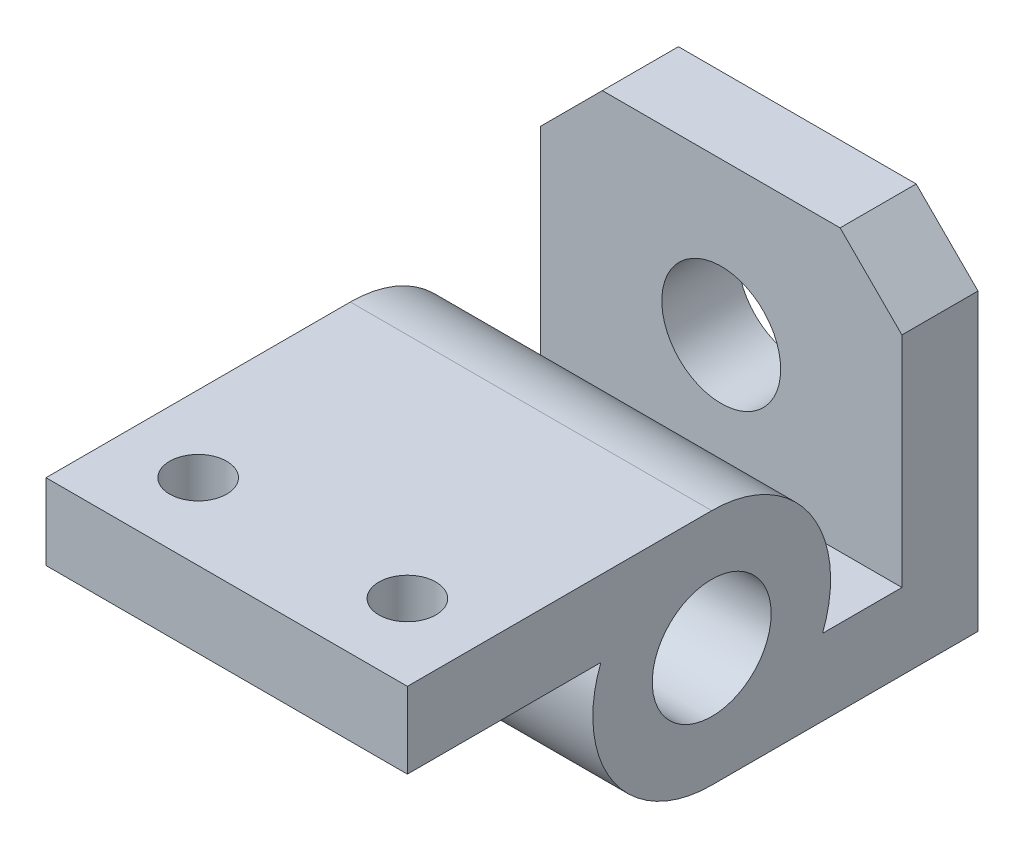
ISO-10303-21;
HEADER;
FILE_DESCRIPTION(('STEP AP214'),'2;1');
FILE_NAME('part.step','',(''),(''),'','','');
FILE_SCHEMA(('AUTOMOTIVE_DESIGN { 1 0 10303 214 1 1 1 1 }'));
ENDSEC;
DATA;
#1=APPLICATION_CONTEXT('core data for automotive mechanical design processes');
#2=APPLICATION_PROTOCOL_DEFINITION('international standard','automotive_design',2000,#1);
#3=PRODUCT_CONTEXT('',#1,'mechanical');
#4=PRODUCT('Part','Part','',(#3));
#5=PRODUCT_RELATED_PRODUCT_CATEGORY('part','',(#4));
#6=PRODUCT_DEFINITION_FORMATION('','',#4);
#7=PRODUCT_DEFINITION_CONTEXT('part definition',#1,'design');
#8=PRODUCT_DEFINITION('design','',#6,#7);
#9=PRODUCT_DEFINITION_SHAPE('','',#8);
#10=(LENGTH_UNIT() NAMED_UNIT(*) SI_UNIT(.MILLI.,.METRE.));
#11=(NAMED_UNIT(*) PLANE_ANGLE_UNIT() SI_UNIT($,.RADIAN.));
#12=(NAMED_UNIT(*) SI_UNIT($,.STERADIAN.) SOLID_ANGLE_UNIT());
#13=UNCERTAINTY_MEASURE_WITH_UNIT(LENGTH_MEASURE(1.E-05),#10,'distance_accuracy_value','');
#14=(GEOMETRIC_REPRESENTATION_CONTEXT(3) GLOBAL_UNCERTAINTY_ASSIGNED_CONTEXT((#13)) GLOBAL_UNIT_ASSIGNED_CONTEXT((#10,
#11,#12)) REPRESENTATION_CONTEXT('',''));
#15=CARTESIAN_POINT('',(0.,0.,0.));
#16=DIRECTION('',(0.,0.,1.));
#17=DIRECTION('',(1.,0.,0.));
#18=AXIS2_PLACEMENT_3D('',#15,#16,#17);
#19=CARTESIAN_POINT('',(38.,0.,0.));
#20=DIRECTION('',(-1.,0.,0.));
#21=DIRECTION('',(0.,0.,1.));
#22=AXIS2_PLACEMENT_3D('',#19,#20,#21);
#23=CYLINDRICAL_SURFACE('',#22,25.);
#24=CARTESIAN_POINT('',(-38.,0.,0.));
#25=DIRECTION('',(1.,0.,0.));
#26=DIRECTION('',(0.,0.,-1.));
#27=AXIS2_PLACEMENT_3D('',#24,#25,#26);
#28=CIRCLE('',#27,25.);
#29=CARTESIAN_POINT('',(-38.,-9.00000000000001,-23.3238075793812));
#30=VERTEX_POINT('',#29);
#31=CARTESIAN_POINT('',(-38.,25.,0.));
#32=VERTEX_POINT('',#31);
#33=EDGE_CURVE('E151',#30,#32,#28,.T.);
#34=ORIENTED_EDGE('',*,*,#33,.T.);
#35=DIRECTION('',(-1.,0.,0.));
#36=VECTOR('',#35,1.);
#37=CARTESIAN_POINT('',(38.,25.,0.));
#38=LINE('',#37,#36);
#39=CARTESIAN_POINT('',(38.,25.,0.));
#40=VERTEX_POINT('',#39);
#41=EDGE_CURVE('E132',#40,#32,#38,.T.);
#42=ORIENTED_EDGE('',*,*,#41,.F.);
#43=CARTESIAN_POINT('',(38.,0.,0.));
#44=DIRECTION('',(1.,0.,0.));
#45=DIRECTION('',(0.,0.,-1.));
#46=AXIS2_PLACEMENT_3D('',#43,#44,#45);
#47=CIRCLE('',#46,25.);
#48=CARTESIAN_POINT('',(38.,-9.00000000000001,-23.3238075793812));
#49=VERTEX_POINT('',#48);
#50=EDGE_CURVE('E139',#49,#40,#47,.T.);
#51=ORIENTED_EDGE('',*,*,#50,.F.);
#52=DIRECTION('',(-1.,0.,0.));
#53=VECTOR('',#52,1.);
#54=CARTESIAN_POINT('',(38.,-9.00000000000001,-23.3238075793812));
#55=LINE('',#54,#53);
#56=EDGE_CURVE('E205',#49,#30,#55,.T.);
#57=ORIENTED_EDGE('',*,*,#56,.T.);
#58=EDGE_LOOP('',(#34,#42,#51,#57));
#59=FACE_BOUND('',#58,.T.);
#60=ADVANCED_FACE('F33',(#59),#23,.T.);
#61=CARTESIAN_POINT('',(38.,25.,0.));
#62=DIRECTION('',(0.,-1.,0.));
#63=DIRECTION('',(0.,0.,-1.));
#64=AXIS2_PLACEMENT_3D('',#61,#62,#63);
#65=PLANE('',#64);
#66=CARTESIAN_POINT('',(22.,25.,48.));
#67=DIRECTION('',(0.,1.,0.));
#68=DIRECTION('',(0.,0.,1.));
#69=AXIS2_PLACEMENT_3D('',#66,#67,#68);
#70=CIRCLE('',#69,6.);
#71=CARTESIAN_POINT('',(22.,25.,54.));
#72=VERTEX_POINT('',#71);
#73=EDGE_CURVE('E182',#72,#72,#70,.T.);
#74=ORIENTED_EDGE('',*,*,#73,.F.);
#75=EDGE_LOOP('',(#74));
#76=FACE_BOUND('',#75,.T.);
#77=CARTESIAN_POINT('',(-22.,25.,48.));
#78=DIRECTION('',(0.,1.,0.));
#79=DIRECTION('',(0.,0.,1.));
#80=AXIS2_PLACEMENT_3D('',#77,#78,#79);
#81=CIRCLE('',#80,6.);
#82=CARTESIAN_POINT('',(-22.,25.,54.));
#83=VERTEX_POINT('',#82);
#84=EDGE_CURVE('E171',#83,#83,#81,.T.);
#85=ORIENTED_EDGE('',*,*,#84,.F.);
#86=EDGE_LOOP('',(#85));
#87=FACE_BOUND('',#86,.T.);
#88=DIRECTION('',(0.,0.,1.));
#89=VECTOR('',#88,1.);
#90=CARTESIAN_POINT('',(-38.,25.,0.));
#91=LINE('',#90,#89);
#92=CARTESIAN_POINT('',(-38.,25.,64.));
#93=VERTEX_POINT('',#92);
#94=EDGE_CURVE('E207',#32,#93,#91,.T.);
#95=ORIENTED_EDGE('',*,*,#94,.T.);
#96=DIRECTION('',(-1.,0.,0.));
#97=VECTOR('',#96,1.);
#98=CARTESIAN_POINT('',(38.,25.,64.));
#99=LINE('',#98,#97);
#100=CARTESIAN_POINT('',(38.,25.,64.));
#101=VERTEX_POINT('',#100);
#102=EDGE_CURVE('E135',#101,#93,#99,.T.);
#103=ORIENTED_EDGE('',*,*,#102,.F.);
#104=DIRECTION('',(0.,0.,1.));
#105=VECTOR('',#104,1.);
#106=CARTESIAN_POINT('',(38.,25.,0.));
#107=LINE('',#106,#105);
#108=EDGE_CURVE('E128',#40,#101,#107,.T.);
#109=ORIENTED_EDGE('',*,*,#108,.F.);
#110=ORIENTED_EDGE('',*,*,#41,.T.);
#111=EDGE_LOOP('',(#95,#103,#109,#110));
#112=FACE_BOUND('',#111,.T.);
#113=ADVANCED_FACE('F130',(#76,#87,#112),#65,.F.);
#114=CARTESIAN_POINT('',(38.,25.,64.));
#115=DIRECTION('',(0.,0.,-1.));
#116=DIRECTION('',(-1.,0.,0.));
#117=AXIS2_PLACEMENT_3D('',#114,#115,#116);
#118=PLANE('',#117);
#119=DIRECTION('',(0.,-1.,0.));
#120=VECTOR('',#119,1.);
#121=CARTESIAN_POINT('',(-38.,25.,64.));
#122=LINE('',#121,#120);
#123=CARTESIAN_POINT('',(-38.,8.99999999999999,64.));
#124=VERTEX_POINT('',#123);
#125=EDGE_CURVE('E209',#93,#124,#122,.T.);
#126=ORIENTED_EDGE('',*,*,#125,.T.);
#127=DIRECTION('',(-1.,0.,0.));
#128=VECTOR('',#127,1.);
#129=CARTESIAN_POINT('',(38.,8.99999999999999,64.));
#130=LINE('',#129,#128);
#131=CARTESIAN_POINT('',(38.,8.99999999999999,64.));
#132=VERTEX_POINT('',#131);
#133=EDGE_CURVE('E156',#132,#124,#130,.T.);
#134=ORIENTED_EDGE('',*,*,#133,.F.);
#135=DIRECTION('',(0.,-1.,0.));
#136=VECTOR('',#135,1.);
#137=CARTESIAN_POINT('',(38.,25.,64.));
#138=LINE('',#137,#136);
#139=EDGE_CURVE('E138',#101,#132,#138,.T.);
#140=ORIENTED_EDGE('',*,*,#139,.F.);
#141=ORIENTED_EDGE('',*,*,#102,.T.);
#142=EDGE_LOOP('',(#126,#134,#140,#141));
#143=FACE_BOUND('',#142,.T.);
#144=ADVANCED_FACE('F261',(#143),#118,.F.);
#145=CARTESIAN_POINT('',(38.,8.99999999999999,64.));
#146=DIRECTION('',(0.,1.,0.));
#147=DIRECTION('',(0.,0.,1.));
#148=AXIS2_PLACEMENT_3D('',#145,#146,#147);
#149=PLANE('',#148);
#150=CARTESIAN_POINT('',(22.,8.99999999999999,48.));
#151=DIRECTION('',(0.,1.,0.));
#152=DIRECTION('',(0.,0.,1.));
#153=AXIS2_PLACEMENT_3D('',#150,#151,#152);
#154=CIRCLE('',#153,6.);
#155=CARTESIAN_POINT('',(22.,8.99999999999999,54.));
#156=VERTEX_POINT('',#155);
#157=EDGE_CURVE('E37',#156,#156,#154,.T.);
#158=ORIENTED_EDGE('',*,*,#157,.T.);
#159=EDGE_LOOP('',(#158));
#160=FACE_BOUND('',#159,.T.);
#161=CARTESIAN_POINT('',(-22.,8.99999999999999,48.));
#162=DIRECTION('',(0.,1.,0.));
#163=DIRECTION('',(0.,0.,1.));
#164=AXIS2_PLACEMENT_3D('',#161,#162,#163);
#165=CIRCLE('',#164,6.);
#166=CARTESIAN_POINT('',(-22.,8.99999999999999,54.));
#167=VERTEX_POINT('',#166);
#168=EDGE_CURVE('E168',#167,#167,#165,.T.);
#169=ORIENTED_EDGE('',*,*,#168,.T.);
#170=EDGE_LOOP('',(#169));
#171=FACE_BOUND('',#170,.T.);
#172=DIRECTION('',(0.,0.,-1.));
#173=VECTOR('',#172,1.);
#174=CARTESIAN_POINT('',(-38.,8.99999999999999,64.));
#175=LINE('',#174,#173);
#176=CARTESIAN_POINT('',(-38.,8.99999999999998,23.3238075793812));
#177=VERTEX_POINT('',#176);
#178=EDGE_CURVE('E211',#124,#177,#175,.T.);
#179=ORIENTED_EDGE('',*,*,#178,.T.);
#180=DIRECTION('',(-1.,0.,0.));
#181=VECTOR('',#180,1.);
#182=CARTESIAN_POINT('',(38.,8.99999999999998,23.3238075793812));
#183=LINE('',#182,#181);
#184=CARTESIAN_POINT('',(38.,8.99999999999998,23.3238075793812));
#185=VERTEX_POINT('',#184);
#186=EDGE_CURVE('E238',#185,#177,#183,.T.);
#187=ORIENTED_EDGE('',*,*,#186,.F.);
#188=DIRECTION('',(0.,0.,-1.));
#189=VECTOR('',#188,1.);
#190=CARTESIAN_POINT('',(38.,8.99999999999999,64.));
#191=LINE('',#190,#189);
#192=EDGE_CURVE('E194',#132,#185,#191,.T.);
#193=ORIENTED_EDGE('',*,*,#192,.F.);
#194=ORIENTED_EDGE('',*,*,#133,.T.);
#195=EDGE_LOOP('',(#179,#187,#193,#194));
#196=FACE_BOUND('',#195,.T.);
#197=ADVANCED_FACE('F245',(#160,#171,#196),#149,.F.);
#198=CARTESIAN_POINT('',(38.,0.,0.));
#199=DIRECTION('',(-1.,0.,0.));
#200=DIRECTION('',(0.,0.,1.));
#201=AXIS2_PLACEMENT_3D('',#198,#199,#200);
#202=CYLINDRICAL_SURFACE('',#201,25.);
#203=CARTESIAN_POINT('',(-38.,0.,0.));
#204=DIRECTION('',(1.,0.,0.));
#205=DIRECTION('',(0.,0.,-1.));
#206=AXIS2_PLACEMENT_3D('',#203,#204,#205);
#207=CIRCLE('',#206,25.);
#208=CARTESIAN_POINT('',(-38.,-25.,0.));
#209=VERTEX_POINT('',#208);
#210=EDGE_CURVE('E213',#177,#209,#207,.T.);
#211=ORIENTED_EDGE('',*,*,#210,.T.);
#212=DIRECTION('',(-1.,0.,0.));
#213=VECTOR('',#212,1.);
#214=CARTESIAN_POINT('',(38.,-25.,0.));
#215=LINE('',#214,#213);
#216=CARTESIAN_POINT('',(38.,-25.,0.));
#217=VERTEX_POINT('',#216);
#218=EDGE_CURVE('E235',#217,#209,#215,.T.);
#219=ORIENTED_EDGE('',*,*,#218,.F.);
#220=CARTESIAN_POINT('',(38.,0.,0.));
#221=DIRECTION('',(1.,0.,0.));
#222=DIRECTION('',(0.,0.,-1.));
#223=AXIS2_PLACEMENT_3D('',#220,#221,#222);
#224=CIRCLE('',#223,25.);
#225=EDGE_CURVE('E196',#185,#217,#224,.T.);
#226=ORIENTED_EDGE('',*,*,#225,.F.);
#227=ORIENTED_EDGE('',*,*,#186,.T.);
#228=EDGE_LOOP('',(#211,#219,#226,#227));
#229=FACE_BOUND('',#228,.T.);
#230=ADVANCED_FACE('F254',(#229),#202,.T.);
#231=CARTESIAN_POINT('',(38.,-25.,0.));
#232=DIRECTION('',(0.,1.,0.));
#233=DIRECTION('',(0.,0.,1.));
#234=AXIS2_PLACEMENT_3D('',#231,#232,#233);
#235=PLANE('',#234);
#236=DIRECTION('',(0.,0.,-1.));
#237=VECTOR('',#236,1.);
#238=CARTESIAN_POINT('',(-38.,-25.,0.));
#239=LINE('',#238,#237);
#240=CARTESIAN_POINT('',(-38.,-25.,-56.));
#241=VERTEX_POINT('',#240);
#242=EDGE_CURVE('E215',#209,#241,#239,.T.);
#243=ORIENTED_EDGE('',*,*,#242,.T.);
#244=DIRECTION('',(-1.,0.,0.));
#245=VECTOR('',#244,1.);
#246=CARTESIAN_POINT('',(38.,-25.,-56.));
#247=LINE('',#246,#245);
#248=CARTESIAN_POINT('',(38.,-25.,-56.));
#249=VERTEX_POINT('',#248);
#250=EDGE_CURVE('E232',#249,#241,#247,.T.);
#251=ORIENTED_EDGE('',*,*,#250,.F.);
#252=DIRECTION('',(0.,0.,-1.));
#253=VECTOR('',#252,1.);
#254=CARTESIAN_POINT('',(38.,-25.,0.));
#255=LINE('',#254,#253);
#256=EDGE_CURVE('E198',#217,#249,#255,.T.);
#257=ORIENTED_EDGE('',*,*,#256,.F.);
#258=ORIENTED_EDGE('',*,*,#218,.T.);
#259=EDGE_LOOP('',(#243,#251,#257,#258));
#260=FACE_BOUND('',#259,.T.);
#261=ADVANCED_FACE('F258',(#260),#235,.F.);
#262=CARTESIAN_POINT('',(38.,-25.,-56.));
#263=DIRECTION('',(0.,0.,1.));
#264=DIRECTION('',(1.,0.,0.));
#265=AXIS2_PLACEMENT_3D('',#262,#263,#264);
#266=PLANE('',#265);
#267=CARTESIAN_POINT('',(0.,18.,-56.));
#268=DIRECTION('',(0.,0.,1.));
#269=DIRECTION('',(1.,0.,0.));
#270=AXIS2_PLACEMENT_3D('',#267,#268,#269);
#271=CIRCLE('',#270,12.5);
#272=CARTESIAN_POINT('',(12.5,18.,-56.));
#273=VERTEX_POINT('',#272);
#274=EDGE_CURVE('E175',#273,#273,#271,.T.);
#275=ORIENTED_EDGE('',*,*,#274,.T.);
#276=EDGE_LOOP('',(#275));
#277=FACE_BOUND('',#276,.T.);
#278=DIRECTION('',(0.,1.,0.));
#279=VECTOR('',#278,1.);
#280=CARTESIAN_POINT('',(-38.,-25.,-56.));
#281=LINE('',#280,#279);
#282=CARTESIAN_POINT('',(-38.,37.,-56.));
#283=VERTEX_POINT('',#282);
#284=EDGE_CURVE('E217',#241,#283,#281,.T.);
#285=ORIENTED_EDGE('',*,*,#284,.T.);
#286=DIRECTION('',(-0.707106781186548,-0.707106781186547,0.));
#287=VECTOR('',#286,1.);
#288=CARTESIAN_POINT('',(-25.,50.,-56.));
#289=LINE('',#288,#287);
#290=CARTESIAN_POINT('',(-25.,50.,-56.));
#291=VERTEX_POINT('',#290);
#292=EDGE_CURVE('E42',#283,#291,#289,.F.);
#293=ORIENTED_EDGE('',*,*,#292,.T.);
#294=DIRECTION('',(-1.,0.,0.));
#295=VECTOR('',#294,1.);
#296=CARTESIAN_POINT('',(38.,50.,-56.));
#297=LINE('',#296,#295);
#298=CARTESIAN_POINT('',(25.,50.,-56.));
#299=VERTEX_POINT('',#298);
#300=EDGE_CURVE('E229',#299,#291,#297,.T.);
#301=ORIENTED_EDGE('',*,*,#300,.F.);
#302=DIRECTION('',(0.707106781186548,-0.707106781186547,0.));
#303=VECTOR('',#302,1.);
#304=CARTESIAN_POINT('',(38.,37.,-56.));
#305=LINE('',#304,#303);
#306=CARTESIAN_POINT('',(38.,37.,-56.));
#307=VERTEX_POINT('',#306);
#308=EDGE_CURVE('E50',#299,#307,#305,.T.);
#309=ORIENTED_EDGE('',*,*,#308,.T.);
#310=DIRECTION('',(0.,1.,0.));
#311=VECTOR('',#310,1.);
#312=CARTESIAN_POINT('',(38.,-25.,-56.));
#313=LINE('',#312,#311);
#314=EDGE_CURVE('E200',#249,#307,#313,.T.);
#315=ORIENTED_EDGE('',*,*,#314,.F.);
#316=ORIENTED_EDGE('',*,*,#250,.T.);
#317=EDGE_LOOP('',(#285,#293,#301,#309,#315,#316));
#318=FACE_BOUND('',#317,.T.);
#319=ADVANCED_FACE('F290',(#277,#318),#266,.F.);
#320=CARTESIAN_POINT('',(38.,50.,-56.));
#321=DIRECTION('',(0.,-1.,0.));
#322=DIRECTION('',(0.,0.,-1.));
#323=AXIS2_PLACEMENT_3D('',#320,#321,#322);
#324=PLANE('',#323);
#325=ORIENTED_EDGE('',*,*,#300,.T.);
#326=DIRECTION('',(0.,0.,1.));
#327=VECTOR('',#326,1.);
#328=CARTESIAN_POINT('',(-25.,50.,-56.));
#329=LINE('',#328,#327);
#330=CARTESIAN_POINT('',(-25.,50.,-40.));
#331=VERTEX_POINT('',#330);
#332=EDGE_CURVE('E154',#291,#331,#329,.T.);
#333=ORIENTED_EDGE('',*,*,#332,.T.);
#334=DIRECTION('',(-1.,0.,0.));
#335=VECTOR('',#334,1.);
#336=CARTESIAN_POINT('',(38.,50.,-40.));
#337=LINE('',#336,#335);
#338=CARTESIAN_POINT('',(25.,50.,-40.));
#339=VERTEX_POINT('',#338);
#340=EDGE_CURVE('E226',#339,#331,#337,.T.);
#341=ORIENTED_EDGE('',*,*,#340,.F.);
#342=DIRECTION('',(0.,0.,-1.));
#343=VECTOR('',#342,1.);
#344=CARTESIAN_POINT('',(25.,50.,-56.));
#345=LINE('',#344,#343);
#346=EDGE_CURVE('E152',#339,#299,#345,.T.);
#347=ORIENTED_EDGE('',*,*,#346,.T.);
#348=EDGE_LOOP('',(#325,#333,#341,#347));
#349=FACE_BOUND('',#348,.T.);
#350=ADVANCED_FACE('F292',(#349),#324,.F.);
#351=CARTESIAN_POINT('',(38.,50.,-40.));
#352=DIRECTION('',(0.,0.,-1.));
#353=DIRECTION('',(0.,1.,0.));
#354=AXIS2_PLACEMENT_3D('',#351,#352,#353);
#355=PLANE('',#354);
#356=CARTESIAN_POINT('',(0.,18.,-40.));
#357=DIRECTION('',(0.,0.,1.));
#358=DIRECTION('',(1.,0.,0.));
#359=AXIS2_PLACEMENT_3D('',#356,#357,#358);
#360=CIRCLE('',#359,12.5);
#361=CARTESIAN_POINT('',(12.5,18.,-40.));
#362=VERTEX_POINT('',#361);
#363=EDGE_CURVE('E170',#362,#362,#360,.T.);
#364=ORIENTED_EDGE('',*,*,#363,.F.);
#365=EDGE_LOOP('',(#364));
#366=FACE_BOUND('',#365,.T.);
#367=ORIENTED_EDGE('',*,*,#340,.T.);
#368=DIRECTION('',(0.707106781186548,0.707106781186547,0.));
#369=VECTOR('',#368,1.);
#370=CARTESIAN_POINT('',(-25.,50.,-40.));
#371=LINE('',#370,#369);
#372=CARTESIAN_POINT('',(-38.,37.,-40.));
#373=VERTEX_POINT('',#372);
#374=EDGE_CURVE('E164',#331,#373,#371,.F.);
#375=ORIENTED_EDGE('',*,*,#374,.T.);
#376=DIRECTION('',(0.,-1.,0.));
#377=VECTOR('',#376,1.);
#378=CARTESIAN_POINT('',(-38.,50.,-40.));
#379=LINE('',#378,#377);
#380=CARTESIAN_POINT('',(-38.,-8.99999999999999,-40.));
#381=VERTEX_POINT('',#380);
#382=EDGE_CURVE('E219',#373,#381,#379,.T.);
#383=ORIENTED_EDGE('',*,*,#382,.T.);
#384=DIRECTION('',(-1.,0.,0.));
#385=VECTOR('',#384,1.);
#386=CARTESIAN_POINT('',(38.,-8.99999999999999,-40.));
#387=LINE('',#386,#385);
#388=CARTESIAN_POINT('',(38.,-8.99999999999999,-40.));
#389=VERTEX_POINT('',#388);
#390=EDGE_CURVE('E223',#389,#381,#387,.T.);
#391=ORIENTED_EDGE('',*,*,#390,.F.);
#392=DIRECTION('',(0.,-1.,0.));
#393=VECTOR('',#392,1.);
#394=CARTESIAN_POINT('',(38.,50.,-40.));
#395=LINE('',#394,#393);
#396=CARTESIAN_POINT('',(38.,37.,-40.));
#397=VERTEX_POINT('',#396);
#398=EDGE_CURVE('E202',#397,#389,#395,.T.);
#399=ORIENTED_EDGE('',*,*,#398,.F.);
#400=DIRECTION('',(-0.707106781186548,0.707106781186547,0.));
#401=VECTOR('',#400,1.);
#402=CARTESIAN_POINT('',(38.,37.,-40.));
#403=LINE('',#402,#401);
#404=EDGE_CURVE('E162',#397,#339,#403,.T.);
#405=ORIENTED_EDGE('',*,*,#404,.T.);
#406=EDGE_LOOP('',(#367,#375,#383,#391,#399,#405));
#407=FACE_BOUND('',#406,.T.);
#408=ADVANCED_FACE('F298',(#366,#407),#355,.F.);
#409=CARTESIAN_POINT('',(38.,-8.99999999999999,-40.));
#410=DIRECTION('',(0.,-1.,0.));
#411=DIRECTION('',(0.,0.,-1.));
#412=AXIS2_PLACEMENT_3D('',#409,#410,#411);
#413=PLANE('',#412);
#414=DIRECTION('',(0.,0.,1.));
#415=VECTOR('',#414,1.);
#416=CARTESIAN_POINT('',(-38.,-8.99999999999999,-40.));
#417=LINE('',#416,#415);
#418=EDGE_CURVE('E148',#381,#30,#417,.T.);
#419=ORIENTED_EDGE('',*,*,#418,.T.);
#420=ORIENTED_EDGE('',*,*,#56,.F.);
#421=DIRECTION('',(0.,0.,1.));
#422=VECTOR('',#421,1.);
#423=CARTESIAN_POINT('',(38.,-8.99999999999999,-40.));
#424=LINE('',#423,#422);
#425=EDGE_CURVE('E144',#389,#49,#424,.T.);
#426=ORIENTED_EDGE('',*,*,#425,.F.);
#427=ORIENTED_EDGE('',*,*,#390,.T.);
#428=EDGE_LOOP('',(#419,#420,#426,#427));
#429=FACE_BOUND('',#428,.T.);
#430=ADVANCED_FACE('F301',(#429),#413,.F.);
#431=CARTESIAN_POINT('',(38.,0.,0.));
#432=DIRECTION('',(1.,0.,0.));
#433=DIRECTION('',(0.,0.,-1.));
#434=AXIS2_PLACEMENT_3D('',#431,#432,#433);
#435=PLANE('',#434);
#436=CARTESIAN_POINT('',(38.,0.,0.));
#437=DIRECTION('',(1.,0.,0.));
#438=DIRECTION('',(0.,0.,-1.));
#439=AXIS2_PLACEMENT_3D('',#436,#437,#438);
#440=CIRCLE('',#439,12.5);
#441=CARTESIAN_POINT('',(38.,0.,-12.5));
#442=VERTEX_POINT('',#441);
#443=EDGE_CURVE('E187',#442,#442,#440,.T.);
#444=ORIENTED_EDGE('',*,*,#443,.F.);
#445=EDGE_LOOP('',(#444));
#446=FACE_BOUND('',#445,.T.);
#447=ORIENTED_EDGE('',*,*,#314,.T.);
#448=DIRECTION('',(0.,0.,1.));
#449=VECTOR('',#448,1.);
#450=CARTESIAN_POINT('',(38.,37.,-40.));
#451=LINE('',#450,#449);
#452=EDGE_CURVE('E11',#307,#397,#451,.T.);
#453=ORIENTED_EDGE('',*,*,#452,.T.);
#454=ORIENTED_EDGE('',*,*,#398,.T.);
#455=ORIENTED_EDGE('',*,*,#425,.T.);
#456=ORIENTED_EDGE('',*,*,#50,.T.);
#457=ORIENTED_EDGE('',*,*,#108,.T.);
#458=ORIENTED_EDGE('',*,*,#139,.T.);
#459=ORIENTED_EDGE('',*,*,#192,.T.);
#460=ORIENTED_EDGE('',*,*,#225,.T.);
#461=ORIENTED_EDGE('',*,*,#256,.T.);
#462=EDGE_LOOP('',(#447,#453,#454,#455,#456,#457,#458,#459,#460,#461));
#463=FACE_BOUND('',#462,.T.);
#464=ADVANCED_FACE('F142',(#446,#463),#435,.T.);
#465=CARTESIAN_POINT('',(-38.,0.,0.));
#466=DIRECTION('',(1.,0.,0.));
#467=DIRECTION('',(0.,0.,-1.));
#468=AXIS2_PLACEMENT_3D('',#465,#466,#467);
#469=PLANE('',#468);
#470=CARTESIAN_POINT('',(-38.,0.,0.));
#471=DIRECTION('',(1.,0.,0.));
#472=DIRECTION('',(0.,0.,-1.));
#473=AXIS2_PLACEMENT_3D('',#470,#471,#472);
#474=CIRCLE('',#473,12.5);
#475=CARTESIAN_POINT('',(-38.,0.,-12.5));
#476=VERTEX_POINT('',#475);
#477=EDGE_CURVE('E190',#476,#476,#474,.T.);
#478=ORIENTED_EDGE('',*,*,#477,.T.);
#479=EDGE_LOOP('',(#478));
#480=FACE_BOUND('',#479,.T.);
#481=ORIENTED_EDGE('',*,*,#382,.F.);
#482=DIRECTION('',(0.,0.,-1.));
#483=VECTOR('',#482,1.);
#484=CARTESIAN_POINT('',(-38.,37.,0.));
#485=LINE('',#484,#483);
#486=EDGE_CURVE('E58',#373,#283,#485,.T.);
#487=ORIENTED_EDGE('',*,*,#486,.T.);
#488=ORIENTED_EDGE('',*,*,#284,.F.);
#489=ORIENTED_EDGE('',*,*,#242,.F.);
#490=ORIENTED_EDGE('',*,*,#210,.F.);
#491=ORIENTED_EDGE('',*,*,#178,.F.);
#492=ORIENTED_EDGE('',*,*,#125,.F.);
#493=ORIENTED_EDGE('',*,*,#94,.F.);
#494=ORIENTED_EDGE('',*,*,#33,.F.);
#495=ORIENTED_EDGE('',*,*,#418,.F.);
#496=EDGE_LOOP('',(#481,#487,#488,#489,#490,#491,#492,#493,#494,#495));
#497=FACE_BOUND('',#496,.T.);
#498=ADVANCED_FACE('F250',(#480,#497),#469,.F.);
#499=CARTESIAN_POINT('',(-38.,0.,0.));
#500=DIRECTION('',(1.,0.,0.));
#501=DIRECTION('',(0.,0.,-1.));
#502=AXIS2_PLACEMENT_3D('',#499,#500,#501);
#503=CYLINDRICAL_SURFACE('',#502,12.5);
#504=ORIENTED_EDGE('',*,*,#477,.F.);
#505=EDGE_LOOP('',(#504));
#506=FACE_BOUND('',#505,.T.);
#507=ORIENTED_EDGE('',*,*,#443,.T.);
#508=EDGE_LOOP('',(#507));
#509=FACE_BOUND('',#508,.T.);
#510=ADVANCED_FACE('F278',(#506,#509),#503,.F.);
#511=CARTESIAN_POINT('',(-25.,50.,-56.));
#512=DIRECTION('',(0.707106781186547,-0.707106781186548,0.));
#513=DIRECTION('',(0.,0.,1.));
#514=AXIS2_PLACEMENT_3D('',#511,#512,#513);
#515=PLANE('',#514);
#516=ORIENTED_EDGE('',*,*,#292,.F.);
#517=ORIENTED_EDGE('',*,*,#486,.F.);
#518=ORIENTED_EDGE('',*,*,#374,.F.);
#519=ORIENTED_EDGE('',*,*,#332,.F.);
#520=EDGE_LOOP('',(#516,#517,#518,#519));
#521=FACE_BOUND('',#520,.T.);
#522=ADVANCED_FACE('F276',(#521),#515,.F.);
#523=CARTESIAN_POINT('',(38.,37.,0.));
#524=DIRECTION('',(0.707106781186547,0.707106781186548,0.));
#525=DIRECTION('',(0.,0.,-1.));
#526=AXIS2_PLACEMENT_3D('',#523,#524,#525);
#527=PLANE('',#526);
#528=ORIENTED_EDGE('',*,*,#308,.F.);
#529=ORIENTED_EDGE('',*,*,#346,.F.);
#530=ORIENTED_EDGE('',*,*,#404,.F.);
#531=ORIENTED_EDGE('',*,*,#452,.F.);
#532=EDGE_LOOP('',(#528,#529,#530,#531));
#533=FACE_BOUND('',#532,.T.);
#534=ADVANCED_FACE('F35',(#533),#527,.T.);
#535=CARTESIAN_POINT('',(0.,18.,-116.));
#536=DIRECTION('',(0.,0.,1.));
#537=DIRECTION('',(1.,0.,0.));
#538=AXIS2_PLACEMENT_3D('',#535,#536,#537);
#539=CYLINDRICAL_SURFACE('',#538,12.5);
#540=ORIENTED_EDGE('',*,*,#363,.T.);
#541=EDGE_LOOP('',(#540));
#542=FACE_BOUND('',#541,.T.);
#543=ORIENTED_EDGE('',*,*,#274,.F.);
#544=EDGE_LOOP('',(#543));
#545=FACE_BOUND('',#544,.T.);
#546=ADVANCED_FACE('F284',(#542,#545),#539,.F.);
#547=CARTESIAN_POINT('',(-22.,-25.,48.));
#548=DIRECTION('',(0.,1.,0.));
#549=DIRECTION('',(0.,0.,1.));
#550=AXIS2_PLACEMENT_3D('',#547,#548,#549);
#551=CYLINDRICAL_SURFACE('',#550,6.);
#552=ORIENTED_EDGE('',*,*,#84,.T.);
#553=EDGE_LOOP('',(#552));
#554=FACE_BOUND('',#553,.T.);
#555=ORIENTED_EDGE('',*,*,#168,.F.);
#556=EDGE_LOOP('',(#555));
#557=FACE_BOUND('',#556,.T.);
#558=ADVANCED_FACE('F355',(#554,#557),#551,.F.);
#559=CARTESIAN_POINT('',(22.,-25.,48.));
#560=DIRECTION('',(0.,1.,0.));
#561=DIRECTION('',(0.,0.,1.));
#562=AXIS2_PLACEMENT_3D('',#559,#560,#561);
#563=CYLINDRICAL_SURFACE('',#562,6.);
#564=ORIENTED_EDGE('',*,*,#73,.T.);
#565=EDGE_LOOP('',(#564));
#566=FACE_BOUND('',#565,.T.);
#567=ORIENTED_EDGE('',*,*,#157,.F.);
#568=EDGE_LOOP('',(#567));
#569=FACE_BOUND('',#568,.T.);
#570=ADVANCED_FACE('F378',(#566,#569),#563,.F.);
#571=CLOSED_SHELL('',(#60,#113,#144,#197,#230,#261,#319,#350,#408,#430,#464,#498,#510,#522,#534,
#546,#558,#570));
#572=MANIFOLD_SOLID_BREP('B2',#571);
#573=ADVANCED_BREP_SHAPE_REPRESENTATION('',(#18,#572),#14);
#574=SHAPE_DEFINITION_REPRESENTATION(#9,#573);
ENDSEC;
END-ISO-10303-21;
